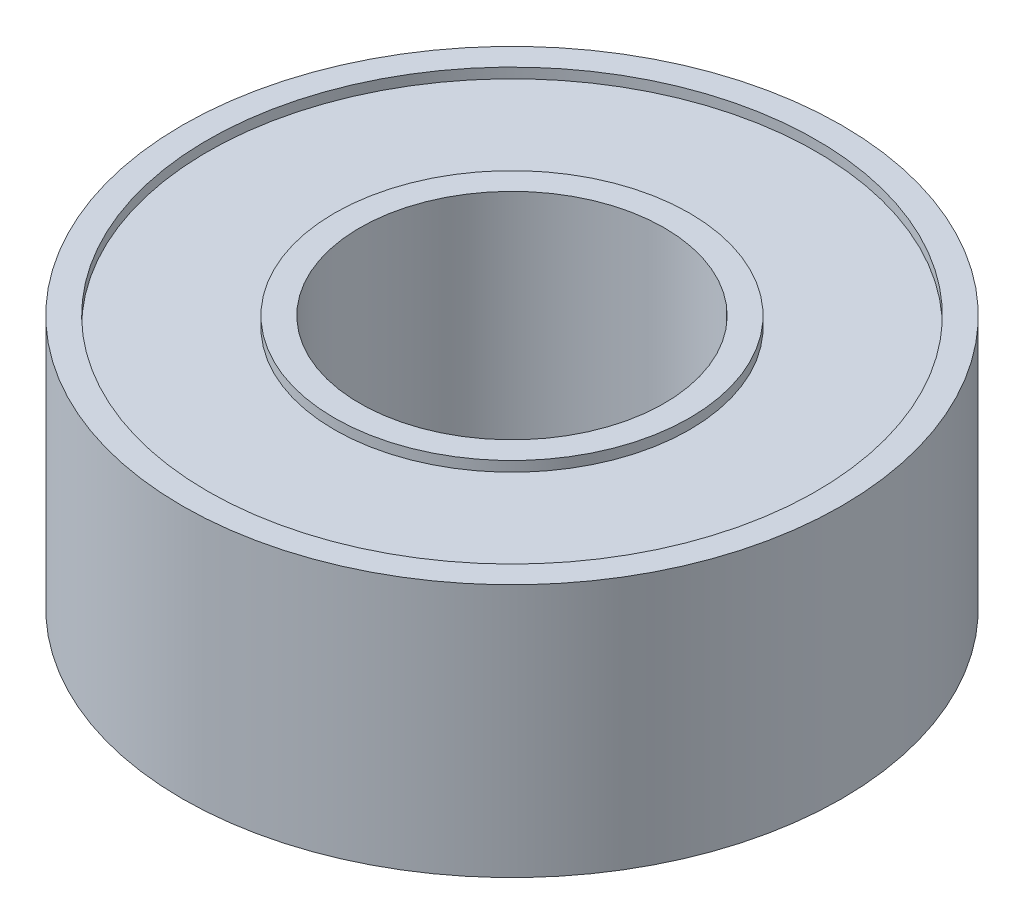
ISO-10303-21;
HEADER;
FILE_DESCRIPTION(('STEP AP214'),'2;1');
FILE_NAME('part.step','',(''),(''),'','','');
FILE_SCHEMA(('AUTOMOTIVE_DESIGN { 1 0 10303 214 1 1 1 1 }'));
ENDSEC;
DATA;
#1=APPLICATION_CONTEXT('core data for automotive mechanical design processes');
#2=APPLICATION_PROTOCOL_DEFINITION('international standard','automotive_design',2000,#1);
#3=PRODUCT_CONTEXT('',#1,'mechanical');
#4=PRODUCT('Part','Part','',(#3));
#5=PRODUCT_RELATED_PRODUCT_CATEGORY('part','',(#4));
#6=PRODUCT_DEFINITION_FORMATION('','',#4);
#7=PRODUCT_DEFINITION_CONTEXT('part definition',#1,'design');
#8=PRODUCT_DEFINITION('design','',#6,#7);
#9=PRODUCT_DEFINITION_SHAPE('','',#8);
#10=(LENGTH_UNIT() NAMED_UNIT(*) SI_UNIT(.MILLI.,.METRE.));
#11=(NAMED_UNIT(*) PLANE_ANGLE_UNIT() SI_UNIT($,.RADIAN.));
#12=(NAMED_UNIT(*) SI_UNIT($,.STERADIAN.) SOLID_ANGLE_UNIT());
#13=UNCERTAINTY_MEASURE_WITH_UNIT(LENGTH_MEASURE(1.E-05),#10,'distance_accuracy_value','');
#14=(GEOMETRIC_REPRESENTATION_CONTEXT(3) GLOBAL_UNCERTAINTY_ASSIGNED_CONTEXT((#13)) GLOBAL_UNIT_ASSIGNED_CONTEXT((#10,
#11,#12)) REPRESENTATION_CONTEXT('',''));
#15=CARTESIAN_POINT('',(0.,0.,0.));
#16=DIRECTION('',(0.,0.,1.));
#17=DIRECTION('',(1.,0.,0.));
#18=AXIS2_PLACEMENT_3D('',#15,#16,#17);
#19=CARTESIAN_POINT('',(0.,5.,0.));
#20=DIRECTION('',(0.,-1.,0.));
#21=DIRECTION('',(0.,0.,-1.));
#22=AXIS2_PLACEMENT_3D('',#19,#20,#21);
#23=CYLINDRICAL_SURFACE('',#22,3.);
#24=CARTESIAN_POINT('',(0.,0.,0.));
#25=DIRECTION('',(0.,-1.,0.));
#26=DIRECTION('',(0.,0.,-1.));
#27=AXIS2_PLACEMENT_3D('',#24,#25,#26);
#28=CIRCLE('',#27,3.);
#29=CARTESIAN_POINT('',(0.,0.,-3.));
#30=VERTEX_POINT('',#29);
#31=EDGE_CURVE('E52',#30,#30,#28,.T.);
#32=ORIENTED_EDGE('',*,*,#31,.T.);
#33=EDGE_LOOP('',(#32));
#34=FACE_BOUND('',#33,.T.);
#35=CARTESIAN_POINT('',(0.,5.,0.));
#36=DIRECTION('',(0.,-1.,0.));
#37=DIRECTION('',(0.,0.,-1.));
#38=AXIS2_PLACEMENT_3D('',#35,#36,#37);
#39=CIRCLE('',#38,3.);
#40=CARTESIAN_POINT('',(0.,5.,-3.));
#41=VERTEX_POINT('',#40);
#42=EDGE_CURVE('E18',#41,#41,#39,.T.);
#43=ORIENTED_EDGE('',*,*,#42,.F.);
#44=EDGE_LOOP('',(#43));
#45=FACE_BOUND('',#44,.T.);
#46=ADVANCED_FACE('F15',(#34,#45),#23,.F.);
#47=CARTESIAN_POINT('',(0.,5.,0.));
#48=DIRECTION('',(0.,1.,0.));
#49=DIRECTION('',(0.,0.,1.));
#50=AXIS2_PLACEMENT_3D('',#47,#48,#49);
#51=PLANE('',#50);
#52=CARTESIAN_POINT('',(0.,5.,0.));
#53=DIRECTION('',(0.,1.,0.));
#54=DIRECTION('',(0.,0.,1.));
#55=AXIS2_PLACEMENT_3D('',#52,#53,#54);
#56=CIRCLE('',#55,3.5);
#57=CARTESIAN_POINT('',(0.,5.,3.5));
#58=VERTEX_POINT('',#57);
#59=EDGE_CURVE('E50',#58,#58,#56,.F.);
#60=ORIENTED_EDGE('',*,*,#59,.F.);
#61=EDGE_LOOP('',(#60));
#62=FACE_BOUND('',#61,.T.);
#63=ORIENTED_EDGE('',*,*,#42,.T.);
#64=EDGE_LOOP('',(#63));
#65=FACE_BOUND('',#64,.T.);
#66=ADVANCED_FACE('F59',(#62,#65),#51,.T.);
#67=CARTESIAN_POINT('',(0.,0.,0.));
#68=DIRECTION('',(0.,1.,0.));
#69=DIRECTION('',(0.,0.,1.));
#70=AXIS2_PLACEMENT_3D('',#67,#68,#69);
#71=PLANE('',#70);
#72=CARTESIAN_POINT('',(0.,0.,0.));
#73=DIRECTION('',(0.,-1.,0.));
#74=DIRECTION('',(0.,0.,-1.));
#75=AXIS2_PLACEMENT_3D('',#72,#73,#74);
#76=CIRCLE('',#75,3.5);
#77=CARTESIAN_POINT('',(0.,0.,-3.5));
#78=VERTEX_POINT('',#77);
#79=EDGE_CURVE('E47',#78,#78,#76,.F.);
#80=ORIENTED_EDGE('',*,*,#79,.F.);
#81=EDGE_LOOP('',(#80));
#82=FACE_BOUND('',#81,.T.);
#83=ORIENTED_EDGE('',*,*,#31,.F.);
#84=EDGE_LOOP('',(#83));
#85=FACE_BOUND('',#84,.T.);
#86=ADVANCED_FACE('F66',(#82,#85),#71,.F.);
#87=CARTESIAN_POINT('',(0.,4.8,0.));
#88=DIRECTION('',(0.,1.,0.));
#89=DIRECTION('',(0.,0.,1.));
#90=AXIS2_PLACEMENT_3D('',#87,#88,#89);
#91=CYLINDRICAL_SURFACE('',#90,3.5);
#92=CARTESIAN_POINT('',(0.,4.8,0.));
#93=DIRECTION('',(0.,1.,0.));
#94=DIRECTION('',(0.,0.,1.));
#95=AXIS2_PLACEMENT_3D('',#92,#93,#94);
#96=CIRCLE('',#95,3.5);
#97=CARTESIAN_POINT('',(0.,4.8,3.5));
#98=VERTEX_POINT('',#97);
#99=EDGE_CURVE('E44',#98,#98,#96,.F.);
#100=ORIENTED_EDGE('',*,*,#99,.F.);
#101=EDGE_LOOP('',(#100));
#102=FACE_BOUND('',#101,.T.);
#103=ORIENTED_EDGE('',*,*,#59,.T.);
#104=EDGE_LOOP('',(#103));
#105=FACE_BOUND('',#104,.T.);
#106=ADVANCED_FACE('F102',(#102,#105),#91,.T.);
#107=CARTESIAN_POINT('',(0.,0.2,0.));
#108=DIRECTION('',(0.,-1.,0.));
#109=DIRECTION('',(0.,0.,-1.));
#110=AXIS2_PLACEMENT_3D('',#107,#108,#109);
#111=CYLINDRICAL_SURFACE('',#110,3.5);
#112=ORIENTED_EDGE('',*,*,#79,.T.);
#113=EDGE_LOOP('',(#112));
#114=FACE_BOUND('',#113,.T.);
#115=CARTESIAN_POINT('',(0.,0.2,0.));
#116=DIRECTION('',(0.,-1.,0.));
#117=DIRECTION('',(0.,0.,-1.));
#118=AXIS2_PLACEMENT_3D('',#115,#116,#117);
#119=CIRCLE('',#118,3.5);
#120=CARTESIAN_POINT('',(0.,0.2,-3.5));
#121=VERTEX_POINT('',#120);
#122=EDGE_CURVE('E41',#121,#121,#119,.F.);
#123=ORIENTED_EDGE('',*,*,#122,.F.);
#124=EDGE_LOOP('',(#123));
#125=FACE_BOUND('',#124,.T.);
#126=ADVANCED_FACE('F98',(#114,#125),#111,.T.);
#127=CARTESIAN_POINT('',(0.,4.8,0.));
#128=DIRECTION('',(0.,1.,0.));
#129=DIRECTION('',(0.,0.,1.));
#130=AXIS2_PLACEMENT_3D('',#127,#128,#129);
#131=PLANE('',#130);
#132=CARTESIAN_POINT('',(0.,4.8,0.));
#133=DIRECTION('',(0.,1.,0.));
#134=DIRECTION('',(0.,0.,1.));
#135=AXIS2_PLACEMENT_3D('',#132,#133,#134);
#136=CIRCLE('',#135,6.);
#137=CARTESIAN_POINT('',(0.,4.8,6.));
#138=VERTEX_POINT('',#137);
#139=EDGE_CURVE('E38',#138,#138,#136,.T.);
#140=ORIENTED_EDGE('',*,*,#139,.T.);
#141=EDGE_LOOP('',(#140));
#142=FACE_BOUND('',#141,.T.);
#143=ORIENTED_EDGE('',*,*,#99,.T.);
#144=EDGE_LOOP('',(#143));
#145=FACE_BOUND('',#144,.T.);
#146=ADVANCED_FACE('F94',(#142,#145),#131,.T.);
#147=CARTESIAN_POINT('',(0.,0.2,0.));
#148=DIRECTION('',(0.,-1.,0.));
#149=DIRECTION('',(0.,0.,-1.));
#150=AXIS2_PLACEMENT_3D('',#147,#148,#149);
#151=PLANE('',#150);
#152=ORIENTED_EDGE('',*,*,#122,.T.);
#153=EDGE_LOOP('',(#152));
#154=FACE_BOUND('',#153,.T.);
#155=CARTESIAN_POINT('',(0.,0.2,0.));
#156=DIRECTION('',(0.,-1.,0.));
#157=DIRECTION('',(0.,0.,-1.));
#158=AXIS2_PLACEMENT_3D('',#155,#156,#157);
#159=CIRCLE('',#158,6.);
#160=CARTESIAN_POINT('',(0.,0.2,-6.));
#161=VERTEX_POINT('',#160);
#162=EDGE_CURVE('E35',#161,#161,#159,.T.);
#163=ORIENTED_EDGE('',*,*,#162,.T.);
#164=EDGE_LOOP('',(#163));
#165=FACE_BOUND('',#164,.T.);
#166=ADVANCED_FACE('F90',(#154,#165),#151,.T.);
#167=CARTESIAN_POINT('',(0.,4.8,0.));
#168=DIRECTION('',(0.,1.,0.));
#169=DIRECTION('',(0.,0.,1.));
#170=AXIS2_PLACEMENT_3D('',#167,#168,#169);
#171=CYLINDRICAL_SURFACE('',#170,6.);
#172=CARTESIAN_POINT('',(0.,5.,0.));
#173=DIRECTION('',(0.,1.,0.));
#174=DIRECTION('',(0.,0.,1.));
#175=AXIS2_PLACEMENT_3D('',#172,#173,#174);
#176=CIRCLE('',#175,6.);
#177=CARTESIAN_POINT('',(0.,5.,6.));
#178=VERTEX_POINT('',#177);
#179=EDGE_CURVE('E32',#178,#178,#176,.F.);
#180=ORIENTED_EDGE('',*,*,#179,.F.);
#181=EDGE_LOOP('',(#180));
#182=FACE_BOUND('',#181,.T.);
#183=ORIENTED_EDGE('',*,*,#139,.F.);
#184=EDGE_LOOP('',(#183));
#185=FACE_BOUND('',#184,.T.);
#186=ADVANCED_FACE('F86',(#182,#185),#171,.F.);
#187=CARTESIAN_POINT('',(0.,0.2,0.));
#188=DIRECTION('',(0.,-1.,0.));
#189=DIRECTION('',(0.,0.,-1.));
#190=AXIS2_PLACEMENT_3D('',#187,#188,#189);
#191=CYLINDRICAL_SURFACE('',#190,6.);
#192=CARTESIAN_POINT('',(0.,0.,0.));
#193=DIRECTION('',(0.,-1.,0.));
#194=DIRECTION('',(0.,0.,-1.));
#195=AXIS2_PLACEMENT_3D('',#192,#193,#194);
#196=CIRCLE('',#195,6.);
#197=CARTESIAN_POINT('',(0.,0.,-6.));
#198=VERTEX_POINT('',#197);
#199=EDGE_CURVE('E27',#198,#198,#196,.T.);
#200=ORIENTED_EDGE('',*,*,#199,.T.);
#201=EDGE_LOOP('',(#200));
#202=FACE_BOUND('',#201,.T.);
#203=ORIENTED_EDGE('',*,*,#162,.F.);
#204=EDGE_LOOP('',(#203));
#205=FACE_BOUND('',#204,.T.);
#206=ADVANCED_FACE('F82',(#202,#205),#191,.F.);
#207=CARTESIAN_POINT('',(0.,5.,0.));
#208=DIRECTION('',(0.,1.,0.));
#209=DIRECTION('',(0.,0.,1.));
#210=AXIS2_PLACEMENT_3D('',#207,#208,#209);
#211=PLANE('',#210);
#212=CARTESIAN_POINT('',(0.,5.,0.));
#213=DIRECTION('',(0.,-1.,0.));
#214=DIRECTION('',(0.,0.,-1.));
#215=AXIS2_PLACEMENT_3D('',#212,#213,#214);
#216=CIRCLE('',#215,6.5);
#217=CARTESIAN_POINT('',(0.,5.,-6.5));
#218=VERTEX_POINT('',#217);
#219=EDGE_CURVE('E22',#218,#218,#216,.T.);
#220=ORIENTED_EDGE('',*,*,#219,.F.);
#221=EDGE_LOOP('',(#220));
#222=FACE_BOUND('',#221,.T.);
#223=ORIENTED_EDGE('',*,*,#179,.T.);
#224=EDGE_LOOP('',(#223));
#225=FACE_BOUND('',#224,.T.);
#226=ADVANCED_FACE('F75',(#222,#225),#211,.T.);
#227=CARTESIAN_POINT('',(0.,0.,0.));
#228=DIRECTION('',(0.,1.,0.));
#229=DIRECTION('',(0.,0.,1.));
#230=AXIS2_PLACEMENT_3D('',#227,#228,#229);
#231=PLANE('',#230);
#232=CARTESIAN_POINT('',(0.,0.,0.));
#233=DIRECTION('',(0.,-1.,0.));
#234=DIRECTION('',(0.,0.,-1.));
#235=AXIS2_PLACEMENT_3D('',#232,#233,#234);
#236=CIRCLE('',#235,6.5);
#237=CARTESIAN_POINT('',(0.,0.,-6.5));
#238=VERTEX_POINT('',#237);
#239=EDGE_CURVE('E10',#238,#238,#236,.F.);
#240=ORIENTED_EDGE('',*,*,#239,.F.);
#241=EDGE_LOOP('',(#240));
#242=FACE_BOUND('',#241,.T.);
#243=ORIENTED_EDGE('',*,*,#199,.F.);
#244=EDGE_LOOP('',(#243));
#245=FACE_BOUND('',#244,.T.);
#246=ADVANCED_FACE('F70',(#242,#245),#231,.F.);
#247=CARTESIAN_POINT('',(0.,5.,0.));
#248=DIRECTION('',(0.,-1.,0.));
#249=DIRECTION('',(0.,0.,-1.));
#250=AXIS2_PLACEMENT_3D('',#247,#248,#249);
#251=CYLINDRICAL_SURFACE('',#250,6.5);
#252=ORIENTED_EDGE('',*,*,#239,.T.);
#253=EDGE_LOOP('',(#252));
#254=FACE_BOUND('',#253,.T.);
#255=ORIENTED_EDGE('',*,*,#219,.T.);
#256=EDGE_LOOP('',(#255));
#257=FACE_BOUND('',#256,.T.);
#258=ADVANCED_FACE('F68',(#254,#257),#251,.T.);
#259=CLOSED_SHELL('',(#46,#66,#86,#106,#126,#146,#166,#186,#206,#226,#246,#258));
#260=MANIFOLD_SOLID_BREP('B1',#259);
#261=ADVANCED_BREP_SHAPE_REPRESENTATION('',(#18,#260),#14);
#262=SHAPE_DEFINITION_REPRESENTATION(#9,#261);
ENDSEC;
END-ISO-10303-21;
